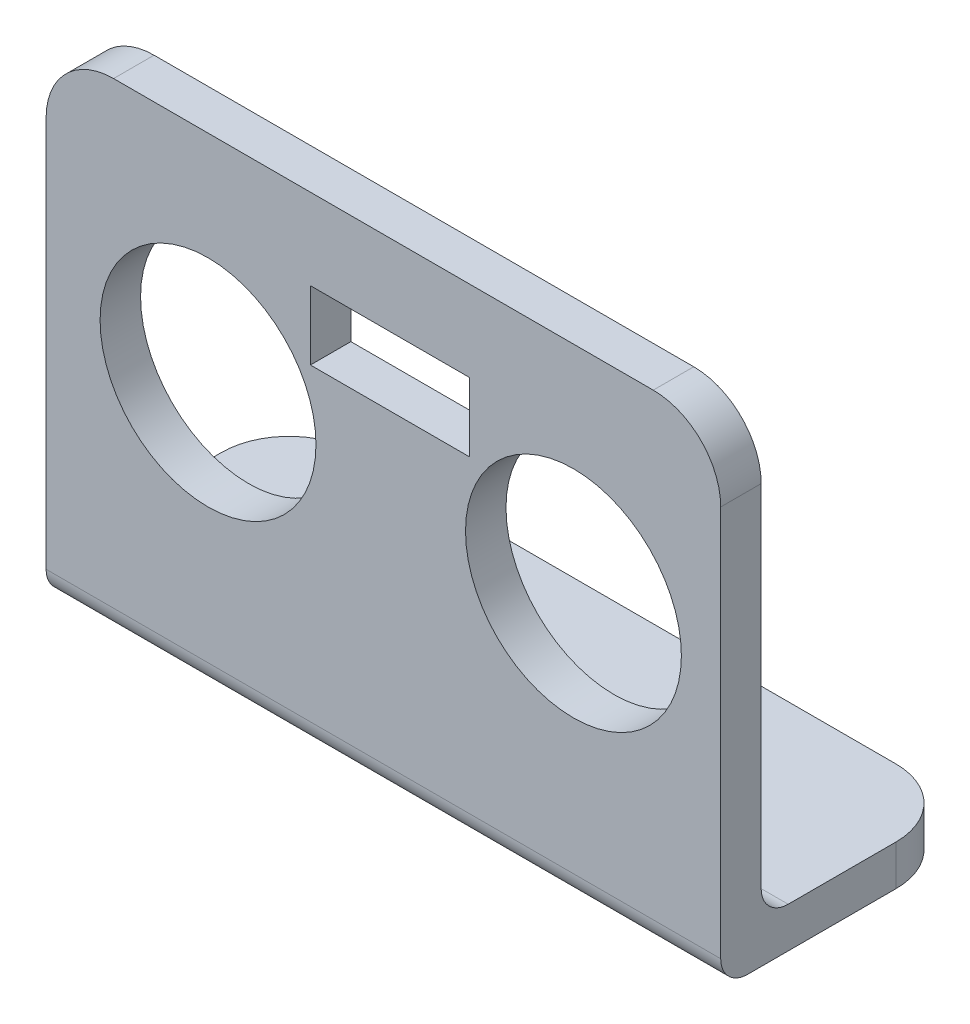
ISO-10303-21;
HEADER;
FILE_DESCRIPTION(('STEP AP214'),'2;1');
FILE_NAME('part.step','',(''),(''),'','','');
FILE_SCHEMA(('AUTOMOTIVE_DESIGN { 1 0 10303 214 1 1 1 1 }'));
ENDSEC;
DATA;
#1=APPLICATION_CONTEXT('core data for automotive mechanical design processes');
#2=APPLICATION_PROTOCOL_DEFINITION('international standard','automotive_design',2000,#1);
#3=PRODUCT_CONTEXT('',#1,'mechanical');
#4=PRODUCT('Part','Part','',(#3));
#5=PRODUCT_RELATED_PRODUCT_CATEGORY('part','',(#4));
#6=PRODUCT_DEFINITION_FORMATION('','',#4);
#7=PRODUCT_DEFINITION_CONTEXT('part definition',#1,'design');
#8=PRODUCT_DEFINITION('design','',#6,#7);
#9=PRODUCT_DEFINITION_SHAPE('','',#8);
#10=(LENGTH_UNIT() NAMED_UNIT(*) SI_UNIT(.MILLI.,.METRE.));
#11=(NAMED_UNIT(*) PLANE_ANGLE_UNIT() SI_UNIT($,.RADIAN.));
#12=(NAMED_UNIT(*) SI_UNIT($,.STERADIAN.) SOLID_ANGLE_UNIT());
#13=UNCERTAINTY_MEASURE_WITH_UNIT(LENGTH_MEASURE(1.E-05),#10,'distance_accuracy_value','');
#14=(GEOMETRIC_REPRESENTATION_CONTEXT(3) GLOBAL_UNCERTAINTY_ASSIGNED_CONTEXT((#13)) GLOBAL_UNIT_ASSIGNED_CONTEXT((#10,
#11,#12)) REPRESENTATION_CONTEXT('',''));
#15=CARTESIAN_POINT('',(0.,0.,0.));
#16=DIRECTION('',(0.,0.,1.));
#17=DIRECTION('',(1.,0.,0.));
#18=AXIS2_PLACEMENT_3D('',#15,#16,#17);
#19=CARTESIAN_POINT('',(0.,0.,0.));
#20=DIRECTION('',(0.,0.,-1.));
#21=DIRECTION('',(-1.,0.,0.));
#22=AXIS2_PLACEMENT_3D('',#19,#20,#21);
#23=PLANE('',#22);
#24=CARTESIAN_POINT('',(-13.,20.,0.));
#25=DIRECTION('',(0.,0.,1.));
#26=DIRECTION('',(1.,0.,0.));
#27=AXIS2_PLACEMENT_3D('',#24,#25,#26);
#28=CIRCLE('',#27,8.);
#29=CARTESIAN_POINT('',(-5.,20.,0.));
#30=VERTEX_POINT('',#29);
#31=EDGE_CURVE('E219',#30,#30,#28,.T.);
#32=ORIENTED_EDGE('',*,*,#31,.T.);
#33=EDGE_LOOP('',(#32));
#34=FACE_BOUND('',#33,.T.);
#35=CARTESIAN_POINT('',(14.0848528137417,19.9999999999993,0.));
#36=DIRECTION('',(0.,0.,1.));
#37=DIRECTION('',(1.,0.,0.));
#38=AXIS2_PLACEMENT_3D('',#35,#36,#37);
#39=CIRCLE('',#38,8.);
#40=CARTESIAN_POINT('',(22.0848528137417,19.9999999999993,0.));
#41=VERTEX_POINT('',#40);
#42=EDGE_CURVE('E178',#41,#41,#39,.T.);
#43=ORIENTED_EDGE('',*,*,#42,.T.);
#44=EDGE_LOOP('',(#43));
#45=FACE_BOUND('',#44,.T.);
#46=DIRECTION('',(1.,0.,0.));
#47=VECTOR('',#46,1.);
#48=CARTESIAN_POINT('',(-5.41188985844397,24.906674858927,0.));
#49=LINE('',#48,#47);
#50=CARTESIAN_POINT('',(-5.41188985844397,24.906674858927,0.));
#51=VERTEX_POINT('',#50);
#52=CARTESIAN_POINT('',(6.39518174141901,24.906674858927,0.));
#53=VERTEX_POINT('',#52);
#54=EDGE_CURVE('E170',#51,#53,#49,.T.);
#55=ORIENTED_EDGE('',*,*,#54,.T.);
#56=DIRECTION('',(0.,1.,0.));
#57=VECTOR('',#56,1.);
#58=CARTESIAN_POINT('',(6.39518174141901,24.906674858927,0.));
#59=LINE('',#58,#57);
#60=CARTESIAN_POINT('',(6.39518174141901,30.,0.));
#61=VERTEX_POINT('',#60);
#62=EDGE_CURVE('E195',#53,#61,#59,.T.);
#63=ORIENTED_EDGE('',*,*,#62,.T.);
#64=DIRECTION('',(-1.,0.,0.));
#65=VECTOR('',#64,1.);
#66=CARTESIAN_POINT('',(6.39518174141901,30.,0.));
#67=LINE('',#66,#65);
#68=CARTESIAN_POINT('',(-5.41188985844397,30.,0.));
#69=VERTEX_POINT('',#68);
#70=EDGE_CURVE('E176',#61,#69,#67,.T.);
#71=ORIENTED_EDGE('',*,*,#70,.T.);
#72=DIRECTION('',(0.,-1.,0.));
#73=VECTOR('',#72,1.);
#74=CARTESIAN_POINT('',(-5.41188985844397,30.,0.));
#75=LINE('',#74,#73);
#76=EDGE_CURVE('E201',#69,#51,#75,.T.);
#77=ORIENTED_EDGE('',*,*,#76,.T.);
#78=EDGE_LOOP('',(#55,#63,#71,#77));
#79=FACE_BOUND('',#78,.T.);
#80=DIRECTION('',(0.,1.,0.));
#81=VECTOR('',#80,1.);
#82=CARTESIAN_POINT('',(25.,0.,0.));
#83=LINE('',#82,#81);
#84=CARTESIAN_POINT('',(25.,5.,0.));
#85=VERTEX_POINT('',#84);
#86=CARTESIAN_POINT('',(25.,31.,0.));
#87=VERTEX_POINT('',#86);
#88=EDGE_CURVE('E247',#85,#87,#83,.T.);
#89=ORIENTED_EDGE('',*,*,#88,.F.);
#90=DIRECTION('',(-1.,0.,0.));
#91=VECTOR('',#90,1.);
#92=CARTESIAN_POINT('',(0.,5.,0.));
#93=LINE('',#92,#91);
#94=CARTESIAN_POINT('',(-25.,5.,0.));
#95=VERTEX_POINT('',#94);
#96=EDGE_CURVE('E314',#85,#95,#93,.T.);
#97=ORIENTED_EDGE('',*,*,#96,.T.);
#98=DIRECTION('',(0.,-1.,0.));
#99=VECTOR('',#98,1.);
#100=CARTESIAN_POINT('',(-25.,0.,0.));
#101=LINE('',#100,#99);
#102=CARTESIAN_POINT('',(-25.,31.,0.));
#103=VERTEX_POINT('',#102);
#104=EDGE_CURVE('E227',#103,#95,#101,.T.);
#105=ORIENTED_EDGE('',*,*,#104,.F.);
#106=CARTESIAN_POINT('',(-20.,31.,0.));
#107=DIRECTION('',(0.,0.,-1.));
#108=DIRECTION('',(-1.,0.,0.));
#109=AXIS2_PLACEMENT_3D('',#106,#107,#108);
#110=CIRCLE('',#109,5.);
#111=CARTESIAN_POINT('',(-20.,36.,0.));
#112=VERTEX_POINT('',#111);
#113=EDGE_CURVE('E301',#103,#112,#110,.T.);
#114=ORIENTED_EDGE('',*,*,#113,.T.);
#115=DIRECTION('',(-1.,0.,0.));
#116=VECTOR('',#115,1.);
#117=CARTESIAN_POINT('',(-25.,36.,0.));
#118=LINE('',#117,#116);
#119=CARTESIAN_POINT('',(20.,36.,0.));
#120=VERTEX_POINT('',#119);
#121=EDGE_CURVE('E236',#120,#112,#118,.T.);
#122=ORIENTED_EDGE('',*,*,#121,.F.);
#123=CARTESIAN_POINT('',(20.,31.,0.));
#124=DIRECTION('',(0.,0.,-1.));
#125=DIRECTION('',(-1.,0.,0.));
#126=AXIS2_PLACEMENT_3D('',#123,#124,#125);
#127=CIRCLE('',#126,5.);
#128=EDGE_CURVE('E304',#120,#87,#127,.T.);
#129=ORIENTED_EDGE('',*,*,#128,.T.);
#130=EDGE_LOOP('',(#89,#97,#105,#114,#122,#129));
#131=FACE_BOUND('',#130,.T.);
#132=ADVANCED_FACE('F44',(#34,#45,#79,#131),#23,.T.);
#133=CARTESIAN_POINT('',(0.,0.,3.));
#134=DIRECTION('',(0.,0.,-1.));
#135=DIRECTION('',(-1.,0.,0.));
#136=AXIS2_PLACEMENT_3D('',#133,#134,#135);
#137=PLANE('',#136);
#138=DIRECTION('',(0.,-1.,0.));
#139=VECTOR('',#138,1.);
#140=CARTESIAN_POINT('',(-25.,0.,3.));
#141=LINE('',#140,#139);
#142=CARTESIAN_POINT('',(-25.,31.,3.));
#143=VERTEX_POINT('',#142);
#144=CARTESIAN_POINT('',(-25.,2.,3.));
#145=VERTEX_POINT('',#144);
#146=EDGE_CURVE('E231',#143,#145,#141,.T.);
#147=ORIENTED_EDGE('',*,*,#146,.T.);
#148=DIRECTION('',(1.,0.,0.));
#149=VECTOR('',#148,1.);
#150=CARTESIAN_POINT('',(0.,2.,3.));
#151=LINE('',#150,#149);
#152=CARTESIAN_POINT('',(25.,2.,3.));
#153=VERTEX_POINT('',#152);
#154=EDGE_CURVE('E321',#145,#153,#151,.T.);
#155=ORIENTED_EDGE('',*,*,#154,.T.);
#156=DIRECTION('',(0.,1.,0.));
#157=VECTOR('',#156,1.);
#158=CARTESIAN_POINT('',(25.,0.,3.));
#159=LINE('',#158,#157);
#160=CARTESIAN_POINT('',(25.,31.,3.));
#161=VERTEX_POINT('',#160);
#162=EDGE_CURVE('E235',#153,#161,#159,.T.);
#163=ORIENTED_EDGE('',*,*,#162,.T.);
#164=CARTESIAN_POINT('',(20.,31.,3.));
#165=DIRECTION('',(0.,0.,-1.));
#166=DIRECTION('',(-1.,0.,0.));
#167=AXIS2_PLACEMENT_3D('',#164,#165,#166);
#168=CIRCLE('',#167,5.);
#169=CARTESIAN_POINT('',(20.,36.,3.));
#170=VERTEX_POINT('',#169);
#171=EDGE_CURVE('E311',#161,#170,#168,.F.);
#172=ORIENTED_EDGE('',*,*,#171,.T.);
#173=DIRECTION('',(-1.,0.,0.));
#174=VECTOR('',#173,1.);
#175=CARTESIAN_POINT('',(-25.,36.,3.));
#176=LINE('',#175,#174);
#177=CARTESIAN_POINT('',(-20.,36.,3.));
#178=VERTEX_POINT('',#177);
#179=EDGE_CURVE('E239',#170,#178,#176,.T.);
#180=ORIENTED_EDGE('',*,*,#179,.T.);
#181=CARTESIAN_POINT('',(-20.,31.,3.));
#182=DIRECTION('',(0.,0.,-1.));
#183=DIRECTION('',(-1.,0.,0.));
#184=AXIS2_PLACEMENT_3D('',#181,#182,#183);
#185=CIRCLE('',#184,5.);
#186=EDGE_CURVE('E308',#178,#143,#185,.F.);
#187=ORIENTED_EDGE('',*,*,#186,.T.);
#188=EDGE_LOOP('',(#147,#155,#163,#172,#180,#187));
#189=FACE_BOUND('',#188,.T.);
#190=DIRECTION('',(0.,1.,0.));
#191=VECTOR('',#190,1.);
#192=CARTESIAN_POINT('',(6.39518174141901,24.906674858927,3.));
#193=LINE('',#192,#191);
#194=CARTESIAN_POINT('',(6.39518174141901,24.906674858927,3.));
#195=VERTEX_POINT('',#194);
#196=CARTESIAN_POINT('',(6.39518174141901,30.,3.));
#197=VERTEX_POINT('',#196);
#198=EDGE_CURVE('E158',#195,#197,#193,.T.);
#199=ORIENTED_EDGE('',*,*,#198,.F.);
#200=DIRECTION('',(1.,0.,0.));
#201=VECTOR('',#200,1.);
#202=CARTESIAN_POINT('',(-5.41188985844397,24.906674858927,3.));
#203=LINE('',#202,#201);
#204=CARTESIAN_POINT('',(-5.41188985844397,24.906674858927,3.));
#205=VERTEX_POINT('',#204);
#206=EDGE_CURVE('E189',#205,#195,#203,.T.);
#207=ORIENTED_EDGE('',*,*,#206,.F.);
#208=DIRECTION('',(0.,-1.,0.));
#209=VECTOR('',#208,1.);
#210=CARTESIAN_POINT('',(-5.41188985844397,30.,3.));
#211=LINE('',#210,#209);
#212=CARTESIAN_POINT('',(-5.41188985844397,30.,3.));
#213=VERTEX_POINT('',#212);
#214=EDGE_CURVE('E185',#213,#205,#211,.T.);
#215=ORIENTED_EDGE('',*,*,#214,.F.);
#216=DIRECTION('',(-1.,0.,0.));
#217=VECTOR('',#216,1.);
#218=CARTESIAN_POINT('',(6.39518174141901,30.,3.));
#219=LINE('',#218,#217);
#220=EDGE_CURVE('E169',#197,#213,#219,.T.);
#221=ORIENTED_EDGE('',*,*,#220,.F.);
#222=EDGE_LOOP('',(#199,#207,#215,#221));
#223=FACE_BOUND('',#222,.T.);
#224=CARTESIAN_POINT('',(-13.,20.,3.));
#225=DIRECTION('',(0.,0.,1.));
#226=DIRECTION('',(1.,0.,0.));
#227=AXIS2_PLACEMENT_3D('',#224,#225,#226);
#228=CIRCLE('',#227,8.);
#229=CARTESIAN_POINT('',(-5.,20.,3.));
#230=VERTEX_POINT('',#229);
#231=EDGE_CURVE('E223',#230,#230,#228,.T.);
#232=ORIENTED_EDGE('',*,*,#231,.F.);
#233=EDGE_LOOP('',(#232));
#234=FACE_BOUND('',#233,.T.);
#235=CARTESIAN_POINT('',(14.0848528137417,19.9999999999993,3.));
#236=DIRECTION('',(0.,0.,1.));
#237=DIRECTION('',(1.,0.,0.));
#238=AXIS2_PLACEMENT_3D('',#235,#236,#237);
#239=CIRCLE('',#238,8.);
#240=CARTESIAN_POINT('',(22.0848528137417,19.9999999999993,3.));
#241=VERTEX_POINT('',#240);
#242=EDGE_CURVE('E215',#241,#241,#239,.T.);
#243=ORIENTED_EDGE('',*,*,#242,.F.);
#244=EDGE_LOOP('',(#243));
#245=FACE_BOUND('',#244,.T.);
#246=ADVANCED_FACE('F182',(#189,#223,#234,#245),#137,.F.);
#247=CARTESIAN_POINT('',(-25.,0.,3.));
#248=DIRECTION('',(1.,0.,0.));
#249=DIRECTION('',(0.,0.,-1.));
#250=AXIS2_PLACEMENT_3D('',#247,#248,#249);
#251=PLANE('',#250);
#252=DIRECTION('',(0.,0.,-1.));
#253=VECTOR('',#252,1.);
#254=CARTESIAN_POINT('',(-25.,0.,3.));
#255=LINE('',#254,#253);
#256=CARTESIAN_POINT('',(-25.,0.,1.));
#257=VERTEX_POINT('',#256);
#258=CARTESIAN_POINT('',(-25.,0.,-10.));
#259=VERTEX_POINT('',#258);
#260=EDGE_CURVE('E255',#257,#259,#255,.T.);
#261=ORIENTED_EDGE('',*,*,#260,.F.);
#262=CARTESIAN_POINT('',(-25.,2.,1.));
#263=DIRECTION('',(1.,0.,0.));
#264=DIRECTION('',(0.,0.,-1.));
#265=AXIS2_PLACEMENT_3D('',#262,#263,#264);
#266=CIRCLE('',#265,2.);
#267=EDGE_CURVE('E329',#257,#145,#266,.F.);
#268=ORIENTED_EDGE('',*,*,#267,.T.);
#269=ORIENTED_EDGE('',*,*,#146,.F.);
#270=DIRECTION('',(0.,0.,-1.));
#271=VECTOR('',#270,1.);
#272=CARTESIAN_POINT('',(-25.,31.,3.));
#273=LINE('',#272,#271);
#274=EDGE_CURVE('E286',#143,#103,#273,.T.);
#275=ORIENTED_EDGE('',*,*,#274,.T.);
#276=ORIENTED_EDGE('',*,*,#104,.T.);
#277=CARTESIAN_POINT('',(-25.,5.,-2.));
#278=DIRECTION('',(1.,0.,0.));
#279=DIRECTION('',(0.,0.,-1.));
#280=AXIS2_PLACEMENT_3D('',#277,#278,#279);
#281=CIRCLE('',#280,2.);
#282=CARTESIAN_POINT('',(-25.,3.,-2.));
#283=VERTEX_POINT('',#282);
#284=EDGE_CURVE('E53',#95,#283,#281,.T.);
#285=ORIENTED_EDGE('',*,*,#284,.T.);
#286=DIRECTION('',(0.,0.,1.));
#287=VECTOR('',#286,1.);
#288=CARTESIAN_POINT('',(-25.,3.,3.));
#289=LINE('',#288,#287);
#290=CARTESIAN_POINT('',(-25.,3.,-10.));
#291=VERTEX_POINT('',#290);
#292=EDGE_CURVE('E336',#291,#283,#289,.T.);
#293=ORIENTED_EDGE('',*,*,#292,.F.);
#294=DIRECTION('',(0.,-1.,0.));
#295=VECTOR('',#294,1.);
#296=CARTESIAN_POINT('',(-25.,0.,-10.));
#297=LINE('',#296,#295);
#298=EDGE_CURVE('E290',#291,#259,#297,.T.);
#299=ORIENTED_EDGE('',*,*,#298,.T.);
#300=EDGE_LOOP('',(#261,#268,#269,#275,#276,#285,#293,#299));
#301=FACE_BOUND('',#300,.T.);
#302=ADVANCED_FACE('F335',(#301),#251,.F.);
#303=CARTESIAN_POINT('',(-25.,0.,3.));
#304=DIRECTION('',(0.,1.,0.));
#305=DIRECTION('',(0.,0.,1.));
#306=AXIS2_PLACEMENT_3D('',#303,#304,#305);
#307=PLANE('',#306);
#308=DIRECTION('',(0.,0.,-1.));
#309=VECTOR('',#308,1.);
#310=CARTESIAN_POINT('',(25.,0.,3.));
#311=LINE('',#310,#309);
#312=CARTESIAN_POINT('',(25.,0.,1.));
#313=VERTEX_POINT('',#312);
#314=CARTESIAN_POINT('',(25.,0.,-10.));
#315=VERTEX_POINT('',#314);
#316=EDGE_CURVE('E243',#313,#315,#311,.T.);
#317=ORIENTED_EDGE('',*,*,#316,.F.);
#318=DIRECTION('',(1.,0.,0.));
#319=VECTOR('',#318,1.);
#320=CARTESIAN_POINT('',(-25.,0.,1.));
#321=LINE('',#320,#319);
#322=EDGE_CURVE('E60',#313,#257,#321,.F.);
#323=ORIENTED_EDGE('',*,*,#322,.T.);
#324=ORIENTED_EDGE('',*,*,#260,.T.);
#325=CARTESIAN_POINT('',(-20.,0.,-10.));
#326=DIRECTION('',(0.,1.,0.));
#327=DIRECTION('',(0.,0.,1.));
#328=AXIS2_PLACEMENT_3D('',#325,#326,#327);
#329=CIRCLE('',#328,5.);
#330=CARTESIAN_POINT('',(-20.,0.,-15.));
#331=VERTEX_POINT('',#330);
#332=EDGE_CURVE('E265',#259,#331,#329,.F.);
#333=ORIENTED_EDGE('',*,*,#332,.T.);
#334=DIRECTION('',(-1.,0.,0.));
#335=VECTOR('',#334,1.);
#336=CARTESIAN_POINT('',(-25.,0.,-15.));
#337=LINE('',#336,#335);
#338=CARTESIAN_POINT('',(20.,0.,-15.));
#339=VERTEX_POINT('',#338);
#340=EDGE_CURVE('E350',#339,#331,#337,.T.);
#341=ORIENTED_EDGE('',*,*,#340,.F.);
#342=CARTESIAN_POINT('',(20.,0.,-10.));
#343=DIRECTION('',(0.,1.,0.));
#344=DIRECTION('',(0.,0.,1.));
#345=AXIS2_PLACEMENT_3D('',#342,#343,#344);
#346=CIRCLE('',#345,5.);
#347=EDGE_CURVE('E268',#339,#315,#346,.F.);
#348=ORIENTED_EDGE('',*,*,#347,.T.);
#349=EDGE_LOOP('',(#317,#323,#324,#333,#341,#348));
#350=FACE_BOUND('',#349,.T.);
#351=CARTESIAN_POINT('',(-11.,0.,-7.5));
#352=DIRECTION('',(0.,1.,0.));
#353=DIRECTION('',(0.,0.,1.));
#354=AXIS2_PLACEMENT_3D('',#351,#352,#353);
#355=CIRCLE('',#354,1.6);
#356=CARTESIAN_POINT('',(-11.,0.,-5.9));
#357=VERTEX_POINT('',#356);
#358=EDGE_CURVE('E400',#357,#357,#355,.T.);
#359=ORIENTED_EDGE('',*,*,#358,.T.);
#360=EDGE_LOOP('',(#359));
#361=FACE_BOUND('',#360,.T.);
#362=CARTESIAN_POINT('',(0.,0.,-7.5));
#363=DIRECTION('',(0.,1.,0.));
#364=DIRECTION('',(0.,0.,1.));
#365=AXIS2_PLACEMENT_3D('',#362,#363,#364);
#366=CIRCLE('',#365,1.6);
#367=CARTESIAN_POINT('',(0.,0.,-5.9));
#368=VERTEX_POINT('',#367);
#369=EDGE_CURVE('E391',#368,#368,#366,.T.);
#370=ORIENTED_EDGE('',*,*,#369,.T.);
#371=EDGE_LOOP('',(#370));
#372=FACE_BOUND('',#371,.T.);
#373=CARTESIAN_POINT('',(11.,0.,-7.5));
#374=DIRECTION('',(0.,1.,0.));
#375=DIRECTION('',(0.,0.,1.));
#376=AXIS2_PLACEMENT_3D('',#373,#374,#375);
#377=CIRCLE('',#376,1.6);
#378=CARTESIAN_POINT('',(11.,0.,-5.9));
#379=VERTEX_POINT('',#378);
#380=EDGE_CURVE('E408',#379,#379,#377,.T.);
#381=ORIENTED_EDGE('',*,*,#380,.T.);
#382=EDGE_LOOP('',(#381));
#383=FACE_BOUND('',#382,.T.);
#384=ADVANCED_FACE('F371',(#350,#361,#372,#383),#307,.F.);
#385=CARTESIAN_POINT('',(25.,0.,3.));
#386=DIRECTION('',(-1.,0.,0.));
#387=DIRECTION('',(0.,0.,1.));
#388=AXIS2_PLACEMENT_3D('',#385,#386,#387);
#389=PLANE('',#388);
#390=ORIENTED_EDGE('',*,*,#162,.F.);
#391=CARTESIAN_POINT('',(25.,2.,1.));
#392=DIRECTION('',(-1.,0.,0.));
#393=DIRECTION('',(0.,0.,1.));
#394=AXIS2_PLACEMENT_3D('',#391,#392,#393);
#395=CIRCLE('',#394,2.);
#396=EDGE_CURVE('E68',#153,#313,#395,.F.);
#397=ORIENTED_EDGE('',*,*,#396,.T.);
#398=ORIENTED_EDGE('',*,*,#316,.T.);
#399=DIRECTION('',(0.,-1.,0.));
#400=VECTOR('',#399,1.);
#401=CARTESIAN_POINT('',(25.,0.,-10.));
#402=LINE('',#401,#400);
#403=CARTESIAN_POINT('',(25.,3.,-10.));
#404=VERTEX_POINT('',#403);
#405=EDGE_CURVE('E276',#315,#404,#402,.F.);
#406=ORIENTED_EDGE('',*,*,#405,.T.);
#407=DIRECTION('',(0.,0.,-1.));
#408=VECTOR('',#407,1.);
#409=CARTESIAN_POINT('',(25.,3.,3.));
#410=LINE('',#409,#408);
#411=CARTESIAN_POINT('',(25.,3.,-2.));
#412=VERTEX_POINT('',#411);
#413=EDGE_CURVE('E349',#412,#404,#410,.T.);
#414=ORIENTED_EDGE('',*,*,#413,.F.);
#415=CARTESIAN_POINT('',(25.,5.,-2.));
#416=DIRECTION('',(-1.,0.,0.));
#417=DIRECTION('',(0.,0.,1.));
#418=AXIS2_PLACEMENT_3D('',#415,#416,#417);
#419=CIRCLE('',#418,2.);
#420=EDGE_CURVE('E11',#412,#85,#419,.T.);
#421=ORIENTED_EDGE('',*,*,#420,.T.);
#422=ORIENTED_EDGE('',*,*,#88,.T.);
#423=DIRECTION('',(0.,0.,-1.));
#424=VECTOR('',#423,1.);
#425=CARTESIAN_POINT('',(25.,31.,3.));
#426=LINE('',#425,#424);
#427=EDGE_CURVE('E272',#87,#161,#426,.F.);
#428=ORIENTED_EDGE('',*,*,#427,.T.);
#429=EDGE_LOOP('',(#390,#397,#398,#406,#414,#421,#422,#428));
#430=FACE_BOUND('',#429,.T.);
#431=ADVANCED_FACE('F355',(#430),#389,.F.);
#432=CARTESIAN_POINT('',(-25.,36.,3.));
#433=DIRECTION('',(0.,-1.,0.));
#434=DIRECTION('',(0.,0.,-1.));
#435=AXIS2_PLACEMENT_3D('',#432,#433,#434);
#436=PLANE('',#435);
#437=ORIENTED_EDGE('',*,*,#179,.F.);
#438=DIRECTION('',(0.,0.,-1.));
#439=VECTOR('',#438,1.);
#440=CARTESIAN_POINT('',(20.,36.,3.));
#441=LINE('',#440,#439);
#442=EDGE_CURVE('E297',#170,#120,#441,.T.);
#443=ORIENTED_EDGE('',*,*,#442,.T.);
#444=ORIENTED_EDGE('',*,*,#121,.T.);
#445=DIRECTION('',(0.,0.,-1.));
#446=VECTOR('',#445,1.);
#447=CARTESIAN_POINT('',(-20.,36.,3.));
#448=LINE('',#447,#446);
#449=EDGE_CURVE('E294',#112,#178,#448,.F.);
#450=ORIENTED_EDGE('',*,*,#449,.T.);
#451=EDGE_LOOP('',(#437,#443,#444,#450));
#452=FACE_BOUND('',#451,.T.);
#453=ADVANCED_FACE('F445',(#452),#436,.F.);
#454=CARTESIAN_POINT('',(-13.,20.,3.));
#455=DIRECTION('',(0.,0.,-1.));
#456=DIRECTION('',(-1.,0.,0.));
#457=AXIS2_PLACEMENT_3D('',#454,#455,#456);
#458=CYLINDRICAL_SURFACE('',#457,8.);
#459=ORIENTED_EDGE('',*,*,#231,.T.);
#460=EDGE_LOOP('',(#459));
#461=FACE_BOUND('',#460,.T.);
#462=ORIENTED_EDGE('',*,*,#31,.F.);
#463=EDGE_LOOP('',(#462));
#464=FACE_BOUND('',#463,.T.);
#465=ADVANCED_FACE('F448',(#461,#464),#458,.F.);
#466=CARTESIAN_POINT('',(14.0848528137417,19.9999999999993,3.));
#467=DIRECTION('',(0.,0.,-1.));
#468=DIRECTION('',(-1.,0.,0.));
#469=AXIS2_PLACEMENT_3D('',#466,#467,#468);
#470=CYLINDRICAL_SURFACE('',#469,8.);
#471=ORIENTED_EDGE('',*,*,#242,.T.);
#472=EDGE_LOOP('',(#471));
#473=FACE_BOUND('',#472,.T.);
#474=ORIENTED_EDGE('',*,*,#42,.F.);
#475=EDGE_LOOP('',(#474));
#476=FACE_BOUND('',#475,.T.);
#477=ADVANCED_FACE('F570',(#473,#476),#470,.F.);
#478=CARTESIAN_POINT('',(6.39518174141901,24.906674858927,3.));
#479=DIRECTION('',(-1.,0.,0.));
#480=DIRECTION('',(0.,0.,1.));
#481=AXIS2_PLACEMENT_3D('',#478,#479,#480);
#482=PLANE('',#481);
#483=ORIENTED_EDGE('',*,*,#62,.F.);
#484=DIRECTION('',(0.,0.,-1.));
#485=VECTOR('',#484,1.);
#486=CARTESIAN_POINT('',(6.39518174141901,24.906674858927,3.));
#487=LINE('',#486,#485);
#488=EDGE_CURVE('E164',#195,#53,#487,.T.);
#489=ORIENTED_EDGE('',*,*,#488,.F.);
#490=ORIENTED_EDGE('',*,*,#198,.T.);
#491=DIRECTION('',(0.,0.,-1.));
#492=VECTOR('',#491,1.);
#493=CARTESIAN_POINT('',(6.39518174141901,30.,3.));
#494=LINE('',#493,#492);
#495=EDGE_CURVE('E161',#197,#61,#494,.T.);
#496=ORIENTED_EDGE('',*,*,#495,.T.);
#497=EDGE_LOOP('',(#483,#489,#490,#496));
#498=FACE_BOUND('',#497,.T.);
#499=ADVANCED_FACE('F160',(#498),#482,.T.);
#500=CARTESIAN_POINT('',(6.39518174141901,30.,3.));
#501=DIRECTION('',(0.,-1.,0.));
#502=DIRECTION('',(0.,0.,-1.));
#503=AXIS2_PLACEMENT_3D('',#500,#501,#502);
#504=PLANE('',#503);
#505=ORIENTED_EDGE('',*,*,#70,.F.);
#506=ORIENTED_EDGE('',*,*,#495,.F.);
#507=ORIENTED_EDGE('',*,*,#220,.T.);
#508=DIRECTION('',(0.,0.,-1.));
#509=VECTOR('',#508,1.);
#510=CARTESIAN_POINT('',(-5.41188985844397,30.,3.));
#511=LINE('',#510,#509);
#512=EDGE_CURVE('E179',#213,#69,#511,.T.);
#513=ORIENTED_EDGE('',*,*,#512,.T.);
#514=EDGE_LOOP('',(#505,#506,#507,#513));
#515=FACE_BOUND('',#514,.T.);
#516=ADVANCED_FACE('F173',(#515),#504,.T.);
#517=CARTESIAN_POINT('',(-5.41188985844397,30.,3.));
#518=DIRECTION('',(1.,0.,0.));
#519=DIRECTION('',(0.,0.,-1.));
#520=AXIS2_PLACEMENT_3D('',#517,#518,#519);
#521=PLANE('',#520);
#522=ORIENTED_EDGE('',*,*,#76,.F.);
#523=ORIENTED_EDGE('',*,*,#512,.F.);
#524=ORIENTED_EDGE('',*,*,#214,.T.);
#525=DIRECTION('',(0.,0.,-1.));
#526=VECTOR('',#525,1.);
#527=CARTESIAN_POINT('',(-5.41188985844397,24.906674858927,3.));
#528=LINE('',#527,#526);
#529=EDGE_CURVE('E210',#205,#51,#528,.T.);
#530=ORIENTED_EDGE('',*,*,#529,.T.);
#531=EDGE_LOOP('',(#522,#523,#524,#530));
#532=FACE_BOUND('',#531,.T.);
#533=ADVANCED_FACE('F430',(#532),#521,.T.);
#534=CARTESIAN_POINT('',(-5.41188985844397,24.906674858927,3.));
#535=DIRECTION('',(0.,1.,0.));
#536=DIRECTION('',(0.,0.,1.));
#537=AXIS2_PLACEMENT_3D('',#534,#535,#536);
#538=PLANE('',#537);
#539=ORIENTED_EDGE('',*,*,#54,.F.);
#540=ORIENTED_EDGE('',*,*,#529,.F.);
#541=ORIENTED_EDGE('',*,*,#206,.T.);
#542=ORIENTED_EDGE('',*,*,#488,.T.);
#543=EDGE_LOOP('',(#539,#540,#541,#542));
#544=FACE_BOUND('',#543,.T.);
#545=ADVANCED_FACE('F420',(#544),#538,.T.);
#546=CARTESIAN_POINT('',(0.,3.,0.));
#547=DIRECTION('',(0.,-1.,0.));
#548=DIRECTION('',(0.,0.,-1.));
#549=AXIS2_PLACEMENT_3D('',#546,#547,#548);
#550=PLANE('',#549);
#551=ORIENTED_EDGE('',*,*,#292,.T.);
#552=DIRECTION('',(-1.,0.,0.));
#553=VECTOR('',#552,1.);
#554=CARTESIAN_POINT('',(0.,3.,-2.));
#555=LINE('',#554,#553);
#556=EDGE_CURVE('E318',#283,#412,#555,.F.);
#557=ORIENTED_EDGE('',*,*,#556,.T.);
#558=ORIENTED_EDGE('',*,*,#413,.T.);
#559=CARTESIAN_POINT('',(20.,3.,-10.));
#560=DIRECTION('',(0.,-1.,0.));
#561=DIRECTION('',(0.,0.,-1.));
#562=AXIS2_PLACEMENT_3D('',#559,#560,#561);
#563=CIRCLE('',#562,5.);
#564=CARTESIAN_POINT('',(20.,3.,-15.));
#565=VERTEX_POINT('',#564);
#566=EDGE_CURVE('E283',#404,#565,#563,.F.);
#567=ORIENTED_EDGE('',*,*,#566,.T.);
#568=DIRECTION('',(-1.,0.,0.));
#569=VECTOR('',#568,1.);
#570=CARTESIAN_POINT('',(-25.,3.,-15.));
#571=LINE('',#570,#569);
#572=CARTESIAN_POINT('',(-20.,3.,-15.));
#573=VERTEX_POINT('',#572);
#574=EDGE_CURVE('E198',#565,#573,#571,.T.);
#575=ORIENTED_EDGE('',*,*,#574,.T.);
#576=CARTESIAN_POINT('',(-20.,3.,-10.));
#577=DIRECTION('',(0.,-1.,0.));
#578=DIRECTION('',(0.,0.,-1.));
#579=AXIS2_PLACEMENT_3D('',#576,#577,#578);
#580=CIRCLE('',#579,5.);
#581=EDGE_CURVE('E280',#573,#291,#580,.F.);
#582=ORIENTED_EDGE('',*,*,#581,.T.);
#583=EDGE_LOOP('',(#551,#557,#558,#567,#575,#582));
#584=FACE_BOUND('',#583,.T.);
#585=CARTESIAN_POINT('',(0.,3.,-7.5));
#586=DIRECTION('',(0.,1.,0.));
#587=DIRECTION('',(0.,0.,1.));
#588=AXIS2_PLACEMENT_3D('',#585,#586,#587);
#589=CIRCLE('',#588,1.6);
#590=CARTESIAN_POINT('',(0.,3.,-5.9));
#591=VERTEX_POINT('',#590);
#592=EDGE_CURVE('E388',#591,#591,#589,.T.);
#593=ORIENTED_EDGE('',*,*,#592,.F.);
#594=EDGE_LOOP('',(#593));
#595=FACE_BOUND('',#594,.T.);
#596=CARTESIAN_POINT('',(-11.,3.,-7.5));
#597=DIRECTION('',(0.,1.,0.));
#598=DIRECTION('',(0.,0.,1.));
#599=AXIS2_PLACEMENT_3D('',#596,#597,#598);
#600=CIRCLE('',#599,1.6);
#601=CARTESIAN_POINT('',(-11.,3.,-5.9));
#602=VERTEX_POINT('',#601);
#603=EDGE_CURVE('E397',#602,#602,#600,.T.);
#604=ORIENTED_EDGE('',*,*,#603,.F.);
#605=EDGE_LOOP('',(#604));
#606=FACE_BOUND('',#605,.T.);
#607=CARTESIAN_POINT('',(11.,3.,-7.5));
#608=DIRECTION('',(0.,1.,0.));
#609=DIRECTION('',(0.,0.,1.));
#610=AXIS2_PLACEMENT_3D('',#607,#608,#609);
#611=CIRCLE('',#610,1.6);
#612=CARTESIAN_POINT('',(11.,3.,-5.9));
#613=VERTEX_POINT('',#612);
#614=EDGE_CURVE('E404',#613,#613,#611,.T.);
#615=ORIENTED_EDGE('',*,*,#614,.F.);
#616=EDGE_LOOP('',(#615));
#617=FACE_BOUND('',#616,.T.);
#618=ADVANCED_FACE('F343',(#584,#595,#606,#617),#550,.F.);
#619=CARTESIAN_POINT('',(-25.,3.,-15.));
#620=DIRECTION('',(0.,0.,1.));
#621=DIRECTION('',(1.,0.,0.));
#622=AXIS2_PLACEMENT_3D('',#619,#620,#621);
#623=PLANE('',#622);
#624=ORIENTED_EDGE('',*,*,#574,.F.);
#625=DIRECTION('',(0.,-1.,0.));
#626=VECTOR('',#625,1.);
#627=CARTESIAN_POINT('',(20.,3.,-15.));
#628=LINE('',#627,#626);
#629=EDGE_CURVE('E261',#565,#339,#628,.T.);
#630=ORIENTED_EDGE('',*,*,#629,.T.);
#631=ORIENTED_EDGE('',*,*,#340,.T.);
#632=DIRECTION('',(0.,-1.,0.));
#633=VECTOR('',#632,1.);
#634=CARTESIAN_POINT('',(-20.,3.,-15.));
#635=LINE('',#634,#633);
#636=EDGE_CURVE('E258',#331,#573,#635,.F.);
#637=ORIENTED_EDGE('',*,*,#636,.T.);
#638=EDGE_LOOP('',(#624,#630,#631,#637));
#639=FACE_BOUND('',#638,.T.);
#640=ADVANCED_FACE('F380',(#639),#623,.F.);
#641=CARTESIAN_POINT('',(0.,3.,-7.5));
#642=DIRECTION('',(0.,-1.,0.));
#643=DIRECTION('',(0.,0.,-1.));
#644=AXIS2_PLACEMENT_3D('',#641,#642,#643);
#645=CYLINDRICAL_SURFACE('',#644,1.6);
#646=ORIENTED_EDGE('',*,*,#592,.T.);
#647=EDGE_LOOP('',(#646));
#648=FACE_BOUND('',#647,.T.);
#649=ORIENTED_EDGE('',*,*,#369,.F.);
#650=EDGE_LOOP('',(#649));
#651=FACE_BOUND('',#650,.T.);
#652=ADVANCED_FACE('F427',(#648,#651),#645,.F.);
#653=CARTESIAN_POINT('',(-11.,3.,-7.5));
#654=DIRECTION('',(0.,-1.,0.));
#655=DIRECTION('',(0.,0.,-1.));
#656=AXIS2_PLACEMENT_3D('',#653,#654,#655);
#657=CYLINDRICAL_SURFACE('',#656,1.6);
#658=ORIENTED_EDGE('',*,*,#603,.T.);
#659=EDGE_LOOP('',(#658));
#660=FACE_BOUND('',#659,.T.);
#661=ORIENTED_EDGE('',*,*,#358,.F.);
#662=EDGE_LOOP('',(#661));
#663=FACE_BOUND('',#662,.T.);
#664=ADVANCED_FACE('F508',(#660,#663),#657,.F.);
#665=CARTESIAN_POINT('',(11.,3.,-7.5));
#666=DIRECTION('',(0.,-1.,0.));
#667=DIRECTION('',(0.,0.,-1.));
#668=AXIS2_PLACEMENT_3D('',#665,#666,#667);
#669=CYLINDRICAL_SURFACE('',#668,1.6);
#670=ORIENTED_EDGE('',*,*,#614,.T.);
#671=EDGE_LOOP('',(#670));
#672=FACE_BOUND('',#671,.T.);
#673=ORIENTED_EDGE('',*,*,#380,.F.);
#674=EDGE_LOOP('',(#673));
#675=FACE_BOUND('',#674,.T.);
#676=ADVANCED_FACE('F416',(#672,#675),#669,.F.);
#677=CARTESIAN_POINT('',(20.,3.,-10.));
#678=DIRECTION('',(0.,-1.,0.));
#679=DIRECTION('',(0.,0.,-1.));
#680=AXIS2_PLACEMENT_3D('',#677,#678,#679);
#681=CYLINDRICAL_SURFACE('',#680,5.);
#682=ORIENTED_EDGE('',*,*,#566,.F.);
#683=ORIENTED_EDGE('',*,*,#405,.F.);
#684=ORIENTED_EDGE('',*,*,#347,.F.);
#685=ORIENTED_EDGE('',*,*,#629,.F.);
#686=EDGE_LOOP('',(#682,#683,#684,#685));
#687=FACE_BOUND('',#686,.T.);
#688=ADVANCED_FACE('F455',(#687),#681,.T.);
#689=CARTESIAN_POINT('',(-20.,0.,-10.));
#690=DIRECTION('',(0.,-1.,0.));
#691=DIRECTION('',(0.,0.,-1.));
#692=AXIS2_PLACEMENT_3D('',#689,#690,#691);
#693=CYLINDRICAL_SURFACE('',#692,5.);
#694=ORIENTED_EDGE('',*,*,#581,.F.);
#695=ORIENTED_EDGE('',*,*,#636,.F.);
#696=ORIENTED_EDGE('',*,*,#332,.F.);
#697=ORIENTED_EDGE('',*,*,#298,.F.);
#698=EDGE_LOOP('',(#694,#695,#696,#697));
#699=FACE_BOUND('',#698,.T.);
#700=ADVANCED_FACE('F377',(#699),#693,.T.);
#701=CARTESIAN_POINT('',(20.,31.,3.));
#702=DIRECTION('',(0.,0.,-1.));
#703=DIRECTION('',(-1.,0.,0.));
#704=AXIS2_PLACEMENT_3D('',#701,#702,#703);
#705=CYLINDRICAL_SURFACE('',#704,5.);
#706=ORIENTED_EDGE('',*,*,#171,.F.);
#707=ORIENTED_EDGE('',*,*,#427,.F.);
#708=ORIENTED_EDGE('',*,*,#128,.F.);
#709=ORIENTED_EDGE('',*,*,#442,.F.);
#710=EDGE_LOOP('',(#706,#707,#708,#709));
#711=FACE_BOUND('',#710,.T.);
#712=ADVANCED_FACE('F362',(#711),#705,.T.);
#713=CARTESIAN_POINT('',(-20.,31.,3.));
#714=DIRECTION('',(0.,0.,-1.));
#715=DIRECTION('',(-1.,0.,0.));
#716=AXIS2_PLACEMENT_3D('',#713,#714,#715);
#717=CYLINDRICAL_SURFACE('',#716,5.);
#718=ORIENTED_EDGE('',*,*,#186,.F.);
#719=ORIENTED_EDGE('',*,*,#449,.F.);
#720=ORIENTED_EDGE('',*,*,#113,.F.);
#721=ORIENTED_EDGE('',*,*,#274,.F.);
#722=EDGE_LOOP('',(#718,#719,#720,#721));
#723=FACE_BOUND('',#722,.T.);
#724=ADVANCED_FACE('F463',(#723),#717,.T.);
#725=CARTESIAN_POINT('',(0.,5.,-2.));
#726=DIRECTION('',(-1.,0.,0.));
#727=DIRECTION('',(0.,0.,1.));
#728=AXIS2_PLACEMENT_3D('',#725,#726,#727);
#729=CYLINDRICAL_SURFACE('',#728,2.);
#730=ORIENTED_EDGE('',*,*,#420,.F.);
#731=ORIENTED_EDGE('',*,*,#556,.F.);
#732=ORIENTED_EDGE('',*,*,#284,.F.);
#733=ORIENTED_EDGE('',*,*,#96,.F.);
#734=EDGE_LOOP('',(#730,#731,#732,#733));
#735=FACE_BOUND('',#734,.T.);
#736=ADVANCED_FACE('F353',(#735),#729,.F.);
#737=CARTESIAN_POINT('',(0.,2.,1.));
#738=DIRECTION('',(1.,0.,0.));
#739=DIRECTION('',(0.,0.,-1.));
#740=AXIS2_PLACEMENT_3D('',#737,#738,#739);
#741=CYLINDRICAL_SURFACE('',#740,2.);
#742=ORIENTED_EDGE('',*,*,#267,.F.);
#743=ORIENTED_EDGE('',*,*,#322,.F.);
#744=ORIENTED_EDGE('',*,*,#396,.F.);
#745=ORIENTED_EDGE('',*,*,#154,.F.);
#746=EDGE_LOOP('',(#742,#743,#744,#745));
#747=FACE_BOUND('',#746,.T.);
#748=ADVANCED_FACE('F46',(#747),#741,.T.);
#749=CLOSED_SHELL('',(#132,#246,#302,#384,#431,#453,#465,#477,#499,#516,#533,#545,#618,#640,
#652,#664,#676,#688,#700,#712,#724,#736,#748));
#750=MANIFOLD_SOLID_BREP('B2',#749);
#751=ADVANCED_BREP_SHAPE_REPRESENTATION('',(#18,#750),#14);
#752=SHAPE_DEFINITION_REPRESENTATION(#9,#751);
ENDSEC;
END-ISO-10303-21;
